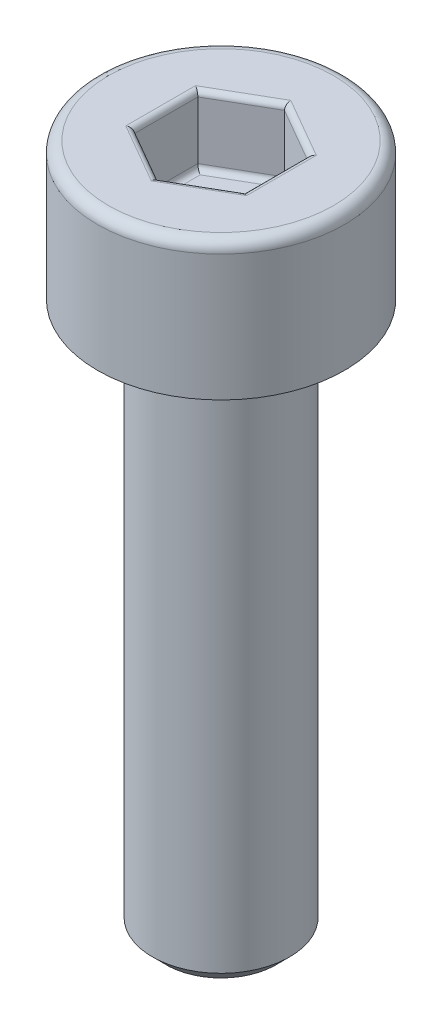
ISO-10303-21;
HEADER;
FILE_DESCRIPTION(('STEP AP214'),'2;1');
FILE_NAME('part.step','',(''),(''),'','','');
FILE_SCHEMA(('AUTOMOTIVE_DESIGN { 1 0 10303 214 1 1 1 1 }'));
ENDSEC;
DATA;
#1=APPLICATION_CONTEXT('core data for automotive mechanical design processes');
#2=APPLICATION_PROTOCOL_DEFINITION('international standard','automotive_design',2000,#1);
#3=PRODUCT_CONTEXT('',#1,'mechanical');
#4=PRODUCT('Part','Part','',(#3));
#5=PRODUCT_RELATED_PRODUCT_CATEGORY('part','',(#4));
#6=PRODUCT_DEFINITION_FORMATION('','',#4);
#7=PRODUCT_DEFINITION_CONTEXT('part definition',#1,'design');
#8=PRODUCT_DEFINITION('design','',#6,#7);
#9=PRODUCT_DEFINITION_SHAPE('','',#8);
#10=(LENGTH_UNIT() NAMED_UNIT(*) SI_UNIT(.MILLI.,.METRE.));
#11=(NAMED_UNIT(*) PLANE_ANGLE_UNIT() SI_UNIT($,.RADIAN.));
#12=(NAMED_UNIT(*) SI_UNIT($,.STERADIAN.) SOLID_ANGLE_UNIT());
#13=UNCERTAINTY_MEASURE_WITH_UNIT(LENGTH_MEASURE(1.E-05),#10,'distance_accuracy_value','');
#14=(GEOMETRIC_REPRESENTATION_CONTEXT(3) GLOBAL_UNCERTAINTY_ASSIGNED_CONTEXT((#13)) GLOBAL_UNIT_ASSIGNED_CONTEXT((#10,
#11,#12)) REPRESENTATION_CONTEXT('',''));
#15=CARTESIAN_POINT('',(0.,0.,0.));
#16=DIRECTION('',(0.,0.,1.));
#17=DIRECTION('',(1.,0.,0.));
#18=AXIS2_PLACEMENT_3D('',#15,#16,#17);
#19=CARTESIAN_POINT('',(0.,-12.5,0.));
#20=DIRECTION('',(0.,-1.,0.));
#21=DIRECTION('',(0.,0.,-1.));
#22=AXIS2_PLACEMENT_3D('',#19,#20,#21);
#23=PLANE('',#22);
#24=CARTESIAN_POINT('',(0.,-12.5,0.));
#25=DIRECTION('',(0.,-1.,0.));
#26=DIRECTION('',(0.,0.,-1.));
#27=AXIS2_PLACEMENT_3D('',#24,#25,#26);
#28=CIRCLE('',#27,0.999999999999996);
#29=CARTESIAN_POINT('',(0.,-12.5,-0.999999999999996));
#30=VERTEX_POINT('',#29);
#31=EDGE_CURVE('E261',#30,#30,#28,.T.);
#32=ORIENTED_EDGE('',*,*,#31,.T.);
#33=EDGE_LOOP('',(#32));
#34=FACE_BOUND('',#33,.T.);
#35=ADVANCED_FACE('F33',(#34),#23,.T.);
#36=CARTESIAN_POINT('',(0.,0.,0.));
#37=DIRECTION('',(0.,1.,0.));
#38=DIRECTION('',(0.,0.,1.));
#39=AXIS2_PLACEMENT_3D('',#36,#37,#38);
#40=CYLINDRICAL_SURFACE('',#39,1.25);
#41=CARTESIAN_POINT('',(0.,-2.75,0.));
#42=DIRECTION('',(0.,-1.,0.));
#43=DIRECTION('',(0.,0.,-1.));
#44=AXIS2_PLACEMENT_3D('',#41,#42,#43);
#45=CIRCLE('',#44,1.25);
#46=CARTESIAN_POINT('',(0.,-2.75,-1.25));
#47=VERTEX_POINT('',#46);
#48=EDGE_CURVE('E258',#47,#47,#45,.T.);
#49=ORIENTED_EDGE('',*,*,#48,.T.);
#50=EDGE_LOOP('',(#49));
#51=FACE_BOUND('',#50,.T.);
#52=CARTESIAN_POINT('',(0.,-12.25,0.));
#53=DIRECTION('',(0.,-1.,0.));
#54=DIRECTION('',(0.,0.,-1.));
#55=AXIS2_PLACEMENT_3D('',#52,#53,#54);
#56=CIRCLE('',#55,1.25);
#57=CARTESIAN_POINT('',(0.,-12.25,-1.25));
#58=VERTEX_POINT('',#57);
#59=EDGE_CURVE('E255',#58,#58,#56,.F.);
#60=ORIENTED_EDGE('',*,*,#59,.T.);
#61=EDGE_LOOP('',(#60));
#62=FACE_BOUND('',#61,.T.);
#63=ADVANCED_FACE('F287',(#51,#62),#40,.T.);
#64=CARTESIAN_POINT('',(-1.25,-2.5,0.));
#65=DIRECTION('',(0.,-1.,0.));
#66=DIRECTION('',(0.,0.,-1.));
#67=AXIS2_PLACEMENT_3D('',#64,#65,#66);
#68=PLANE('',#67);
#69=CARTESIAN_POINT('',(0.,-2.5,0.));
#70=DIRECTION('',(0.,-1.,0.));
#71=DIRECTION('',(0.,0.,-1.));
#72=AXIS2_PLACEMENT_3D('',#69,#70,#71);
#73=CIRCLE('',#72,1.5);
#74=CARTESIAN_POINT('',(0.,-2.5,-1.5));
#75=VERTEX_POINT('',#74);
#76=EDGE_CURVE('E252',#75,#75,#73,.F.);
#77=ORIENTED_EDGE('',*,*,#76,.T.);
#78=EDGE_LOOP('',(#77));
#79=FACE_BOUND('',#78,.T.);
#80=CARTESIAN_POINT('',(0.,-2.5,0.));
#81=DIRECTION('',(0.,1.,0.));
#82=DIRECTION('',(0.,0.,1.));
#83=AXIS2_PLACEMENT_3D('',#80,#81,#82);
#84=CIRCLE('',#83,2.25);
#85=CARTESIAN_POINT('',(0.,-2.5,2.25));
#86=VERTEX_POINT('',#85);
#87=EDGE_CURVE('E249',#86,#86,#84,.T.);
#88=ORIENTED_EDGE('',*,*,#87,.F.);
#89=EDGE_LOOP('',(#88));
#90=FACE_BOUND('',#89,.T.);
#91=ADVANCED_FACE('F293',(#79,#90),#68,.T.);
#92=CARTESIAN_POINT('',(0.,0.,0.));
#93=DIRECTION('',(0.,1.,0.));
#94=DIRECTION('',(0.,0.,1.));
#95=AXIS2_PLACEMENT_3D('',#92,#93,#94);
#96=CYLINDRICAL_SURFACE('',#95,2.25);
#97=CARTESIAN_POINT('',(0.,-0.2,0.));
#98=DIRECTION('',(0.,1.,0.));
#99=DIRECTION('',(0.,0.,1.));
#100=AXIS2_PLACEMENT_3D('',#97,#98,#99);
#101=CIRCLE('',#100,2.25);
#102=CARTESIAN_POINT('',(0.,-0.2,2.25));
#103=VERTEX_POINT('',#102);
#104=EDGE_CURVE('E159',#103,#103,#101,.F.);
#105=ORIENTED_EDGE('',*,*,#104,.T.);
#106=EDGE_LOOP('',(#105));
#107=FACE_BOUND('',#106,.T.);
#108=ORIENTED_EDGE('',*,*,#87,.T.);
#109=EDGE_LOOP('',(#108));
#110=FACE_BOUND('',#109,.T.);
#111=ADVANCED_FACE('F303',(#107,#110),#96,.T.);
#112=CARTESIAN_POINT('',(-2.25,0.,0.));
#113=DIRECTION('',(0.,1.,0.));
#114=DIRECTION('',(0.,0.,1.));
#115=AXIS2_PLACEMENT_3D('',#112,#113,#114);
#116=PLANE('',#115);
#117=DIRECTION('',(0.,0.,1.));
#118=VECTOR('',#117,1.);
#119=CARTESIAN_POINT('',(-1.1,0.,-0.577350269189627));
#120=LINE('',#119,#118);
#121=CARTESIAN_POINT('',(-1.1,0.,0.635085296108588));
#122=VERTEX_POINT('',#121);
#123=CARTESIAN_POINT('',(-1.1,0.,-0.635085296108589));
#124=VERTEX_POINT('',#123);
#125=EDGE_CURVE('E175',#122,#124,#120,.F.);
#126=ORIENTED_EDGE('',*,*,#125,.T.);
#127=DIRECTION('',(-0.866025403784439,0.,0.5));
#128=VECTOR('',#127,1.);
#129=CARTESIAN_POINT('',(-0.0500000000000009,0.,-1.2413030787577));
#130=LINE('',#129,#128);
#131=CARTESIAN_POINT('',(0.,0.,-1.27017059221718));
#132=VERTEX_POINT('',#131);
#133=EDGE_CURVE('E134',#124,#132,#130,.F.);
#134=ORIENTED_EDGE('',*,*,#133,.T.);
#135=DIRECTION('',(-0.866025403784439,0.,-0.5));
#136=VECTOR('',#135,1.);
#137=CARTESIAN_POINT('',(1.05,0.,-0.663952809568071));
#138=LINE('',#137,#136);
#139=CARTESIAN_POINT('',(1.1,0.,-0.63508529610859));
#140=VERTEX_POINT('',#139);
#141=EDGE_CURVE('E161',#132,#140,#138,.F.);
#142=ORIENTED_EDGE('',*,*,#141,.T.);
#143=DIRECTION('',(0.,0.,-1.));
#144=VECTOR('',#143,1.);
#145=CARTESIAN_POINT('',(1.1,0.,0.577350269189625));
#146=LINE('',#145,#144);
#147=CARTESIAN_POINT('',(1.1,0.,0.635085296108588));
#148=VERTEX_POINT('',#147);
#149=EDGE_CURVE('E169',#140,#148,#146,.F.);
#150=ORIENTED_EDGE('',*,*,#149,.T.);
#151=DIRECTION('',(0.866025403784439,0.,-0.5));
#152=VECTOR('',#151,1.);
#153=CARTESIAN_POINT('',(0.0499999999999991,0.,1.24130307875769));
#154=LINE('',#153,#152);
#155=CARTESIAN_POINT('',(0.,0.,1.27017059221718));
#156=VERTEX_POINT('',#155);
#157=EDGE_CURVE('E171',#148,#156,#154,.F.);
#158=ORIENTED_EDGE('',*,*,#157,.T.);
#159=DIRECTION('',(0.866025403784439,0.,0.5));
#160=VECTOR('',#159,1.);
#161=CARTESIAN_POINT('',(-1.05,0.,0.663952809568069));
#162=LINE('',#161,#160);
#163=EDGE_CURVE('E173',#156,#122,#162,.F.);
#164=ORIENTED_EDGE('',*,*,#163,.T.);
#165=EDGE_LOOP('',(#126,#134,#142,#150,#158,#164));
#166=FACE_BOUND('',#165,.T.);
#167=CARTESIAN_POINT('',(0.,0.,0.));
#168=DIRECTION('',(0.,1.,0.));
#169=DIRECTION('',(0.,0.,1.));
#170=AXIS2_PLACEMENT_3D('',#167,#168,#169);
#171=CIRCLE('',#170,2.05);
#172=CARTESIAN_POINT('',(0.,0.,2.05));
#173=VERTEX_POINT('',#172);
#174=EDGE_CURVE('E164',#173,#173,#171,.T.);
#175=ORIENTED_EDGE('',*,*,#174,.T.);
#176=EDGE_LOOP('',(#175));
#177=FACE_BOUND('',#176,.T.);
#178=ADVANCED_FACE('F266',(#166,#177),#116,.T.);
#179=CARTESIAN_POINT('',(0.,-2.5,0.));
#180=DIRECTION('',(0.,1.,0.));
#181=DIRECTION('',(0.,0.,1.));
#182=AXIS2_PLACEMENT_3D('',#179,#180,#181);
#183=CONICAL_SURFACE('',#182,1.5,0.785398163397457);
#184=ORIENTED_EDGE('',*,*,#48,.F.);
#185=EDGE_LOOP('',(#184));
#186=FACE_BOUND('',#185,.T.);
#187=ORIENTED_EDGE('',*,*,#76,.F.);
#188=EDGE_LOOP('',(#187));
#189=FACE_BOUND('',#188,.T.);
#190=ADVANCED_FACE('F281',(#186,#189),#183,.T.);
#191=CARTESIAN_POINT('',(0.,-12.25,0.));
#192=DIRECTION('',(0.,1.,0.));
#193=DIRECTION('',(0.,0.,1.));
#194=AXIS2_PLACEMENT_3D('',#191,#192,#193);
#195=CONICAL_SURFACE('',#194,1.25,0.785398163397458);
#196=ORIENTED_EDGE('',*,*,#31,.F.);
#197=EDGE_LOOP('',(#196));
#198=FACE_BOUND('',#197,.T.);
#199=ORIENTED_EDGE('',*,*,#59,.F.);
#200=EDGE_LOOP('',(#199));
#201=FACE_BOUND('',#200,.T.);
#202=ADVANCED_FACE('F271',(#198,#201),#195,.T.);
#203=CARTESIAN_POINT('',(0.,-0.2,0.));
#204=DIRECTION('',(0.,1.,0.));
#205=DIRECTION('',(0.,0.,1.));
#206=AXIS2_PLACEMENT_3D('',#203,#204,#205);
#207=TOROIDAL_SURFACE('',#206,2.05,0.2);
#208=ORIENTED_EDGE('',*,*,#104,.F.);
#209=EDGE_LOOP('',(#208));
#210=FACE_BOUND('',#209,.T.);
#211=ORIENTED_EDGE('',*,*,#174,.F.);
#212=EDGE_LOOP('',(#211));
#213=FACE_BOUND('',#212,.T.);
#214=ADVANCED_FACE('F268',(#210,#213),#207,.T.);
#215=CARTESIAN_POINT('',(0.999999999999998,-1.25,-0.577350269189627));
#216=DIRECTION('',(0.5,0.,-0.866025403784439));
#217=DIRECTION('',(-0.866025403784439,0.,-0.5));
#218=AXIS2_PLACEMENT_3D('',#215,#216,#217);
#219=PLANE('',#218);
#220=DIRECTION('',(0.,1.,0.));
#221=VECTOR('',#220,1.);
#222=CARTESIAN_POINT('',(0.999999999999998,-1.25,-0.577350269189627));
#223=LINE('',#222,#221);
#224=CARTESIAN_POINT('',(0.999999999999998,-1.15,-0.577350269189627));
#225=VERTEX_POINT('',#224);
#226=CARTESIAN_POINT('',(0.999999999999998,-0.1,-0.577350269189627));
#227=VERTEX_POINT('',#226);
#228=EDGE_CURVE('E243',#225,#227,#223,.T.);
#229=ORIENTED_EDGE('',*,*,#228,.T.);
#230=DIRECTION('',(-0.866025403784439,0.,-0.5));
#231=VECTOR('',#230,1.);
#232=CARTESIAN_POINT('',(0.,-0.1,-1.15470053837925));
#233=LINE('',#232,#231);
#234=CARTESIAN_POINT('',(0.,-0.1,-1.15470053837925));
#235=VERTEX_POINT('',#234);
#236=EDGE_CURVE('E195',#227,#235,#233,.T.);
#237=ORIENTED_EDGE('',*,*,#236,.T.);
#238=DIRECTION('',(0.,1.,0.));
#239=VECTOR('',#238,1.);
#240=CARTESIAN_POINT('',(0.,-1.25,-1.15470053837925));
#241=LINE('',#240,#239);
#242=CARTESIAN_POINT('',(0.,-1.15,-1.15470053837925));
#243=VERTEX_POINT('',#242);
#244=EDGE_CURVE('E145',#243,#235,#241,.T.);
#245=ORIENTED_EDGE('',*,*,#244,.F.);
#246=DIRECTION('',(-0.866025403784439,0.,-0.5));
#247=VECTOR('',#246,1.);
#248=CARTESIAN_POINT('',(0.999999999999998,-1.15,-0.577350269189627));
#249=LINE('',#248,#247);
#250=EDGE_CURVE('E193',#243,#225,#249,.F.);
#251=ORIENTED_EDGE('',*,*,#250,.T.);
#252=EDGE_LOOP('',(#229,#237,#245,#251));
#253=FACE_BOUND('',#252,.T.);
#254=ADVANCED_FACE('F270',(#253),#219,.F.);
#255=CARTESIAN_POINT('',(0.999999999999999,-1.25,0.577350269189625));
#256=DIRECTION('',(1.,0.,0.));
#257=DIRECTION('',(0.,0.,-1.));
#258=AXIS2_PLACEMENT_3D('',#255,#256,#257);
#259=PLANE('',#258);
#260=DIRECTION('',(0.,1.,0.));
#261=VECTOR('',#260,1.);
#262=CARTESIAN_POINT('',(0.999999999999999,-1.25,0.577350269189625));
#263=LINE('',#262,#261);
#264=CARTESIAN_POINT('',(0.999999999999999,-1.15,0.577350269189625));
#265=VERTEX_POINT('',#264);
#266=CARTESIAN_POINT('',(0.999999999999999,-0.1,0.577350269189625));
#267=VERTEX_POINT('',#266);
#268=EDGE_CURVE('E240',#265,#267,#263,.T.);
#269=ORIENTED_EDGE('',*,*,#268,.T.);
#270=DIRECTION('',(0.,0.,-1.));
#271=VECTOR('',#270,1.);
#272=CARTESIAN_POINT('',(0.999999999999998,-0.1,-0.577350269189627));
#273=LINE('',#272,#271);
#274=EDGE_CURVE('E191',#267,#227,#273,.T.);
#275=ORIENTED_EDGE('',*,*,#274,.T.);
#276=ORIENTED_EDGE('',*,*,#228,.F.);
#277=DIRECTION('',(0.,0.,-1.));
#278=VECTOR('',#277,1.);
#279=CARTESIAN_POINT('',(0.999999999999999,-1.15,0.577350269189625));
#280=LINE('',#279,#278);
#281=EDGE_CURVE('E188',#225,#265,#280,.F.);
#282=ORIENTED_EDGE('',*,*,#281,.T.);
#283=EDGE_LOOP('',(#269,#275,#276,#282));
#284=FACE_BOUND('',#283,.T.);
#285=ADVANCED_FACE('F278',(#284),#259,.F.);
#286=CARTESIAN_POINT('',(0.,-1.25,1.15470053837925));
#287=DIRECTION('',(0.5,0.,0.866025403784439));
#288=DIRECTION('',(0.866025403784439,0.,-0.5));
#289=AXIS2_PLACEMENT_3D('',#286,#287,#288);
#290=PLANE('',#289);
#291=DIRECTION('',(0.,1.,0.));
#292=VECTOR('',#291,1.);
#293=CARTESIAN_POINT('',(0.,-1.25,1.15470053837925));
#294=LINE('',#293,#292);
#295=CARTESIAN_POINT('',(0.,-1.15,1.15470053837925));
#296=VERTEX_POINT('',#295);
#297=CARTESIAN_POINT('',(0.,-0.1,1.15470053837925));
#298=VERTEX_POINT('',#297);
#299=EDGE_CURVE('E237',#296,#298,#294,.T.);
#300=ORIENTED_EDGE('',*,*,#299,.T.);
#301=DIRECTION('',(0.866025403784439,0.,-0.5));
#302=VECTOR('',#301,1.);
#303=CARTESIAN_POINT('',(0.999999999999999,-0.1,0.577350269189625));
#304=LINE('',#303,#302);
#305=EDGE_CURVE('E186',#298,#267,#304,.T.);
#306=ORIENTED_EDGE('',*,*,#305,.T.);
#307=ORIENTED_EDGE('',*,*,#268,.F.);
#308=DIRECTION('',(0.866025403784439,0.,-0.5));
#309=VECTOR('',#308,1.);
#310=CARTESIAN_POINT('',(0.,-1.15,1.15470053837925));
#311=LINE('',#310,#309);
#312=EDGE_CURVE('E184',#265,#296,#311,.F.);
#313=ORIENTED_EDGE('',*,*,#312,.T.);
#314=EDGE_LOOP('',(#300,#306,#307,#313));
#315=FACE_BOUND('',#314,.T.);
#316=ADVANCED_FACE('F327',(#315),#290,.F.);
#317=CARTESIAN_POINT('',(-1.,-1.25,0.577350269189625));
#318=DIRECTION('',(-0.5,0.,0.866025403784438));
#319=DIRECTION('',(0.866025403784439,0.,0.5));
#320=AXIS2_PLACEMENT_3D('',#317,#318,#319);
#321=PLANE('',#320);
#322=DIRECTION('',(0.,1.,0.));
#323=VECTOR('',#322,1.);
#324=CARTESIAN_POINT('',(-1.,-1.25,0.577350269189625));
#325=LINE('',#324,#323);
#326=CARTESIAN_POINT('',(-1.,-1.15,0.577350269189625));
#327=VERTEX_POINT('',#326);
#328=CARTESIAN_POINT('',(-1.,-0.1,0.577350269189625));
#329=VERTEX_POINT('',#328);
#330=EDGE_CURVE('E128',#327,#329,#325,.T.);
#331=ORIENTED_EDGE('',*,*,#330,.T.);
#332=DIRECTION('',(0.866025403784439,0.,0.5));
#333=VECTOR('',#332,1.);
#334=CARTESIAN_POINT('',(0.,-0.1,1.15470053837925));
#335=LINE('',#334,#333);
#336=EDGE_CURVE('E182',#329,#298,#335,.T.);
#337=ORIENTED_EDGE('',*,*,#336,.T.);
#338=ORIENTED_EDGE('',*,*,#299,.F.);
#339=DIRECTION('',(0.866025403784439,0.,0.5));
#340=VECTOR('',#339,1.);
#341=CARTESIAN_POINT('',(-1.,-1.15,0.577350269189625));
#342=LINE('',#341,#340);
#343=EDGE_CURVE('E180',#296,#327,#342,.F.);
#344=ORIENTED_EDGE('',*,*,#343,.T.);
#345=EDGE_LOOP('',(#331,#337,#338,#344));
#346=FACE_BOUND('',#345,.T.);
#347=ADVANCED_FACE('F234',(#346),#321,.F.);
#348=CARTESIAN_POINT('',(-1.,-1.25,-0.577350269189627));
#349=DIRECTION('',(-1.,0.,0.));
#350=DIRECTION('',(0.,0.,1.));
#351=AXIS2_PLACEMENT_3D('',#348,#349,#350);
#352=PLANE('',#351);
#353=DIRECTION('',(0.,1.,0.));
#354=VECTOR('',#353,1.);
#355=CARTESIAN_POINT('',(-1.,-1.25,-0.577350269189627));
#356=LINE('',#355,#354);
#357=CARTESIAN_POINT('',(-1.,-1.15,-0.577350269189627));
#358=VERTEX_POINT('',#357);
#359=CARTESIAN_POINT('',(-1.,-0.1,-0.577350269189627));
#360=VERTEX_POINT('',#359);
#361=EDGE_CURVE('E126',#358,#360,#356,.T.);
#362=ORIENTED_EDGE('',*,*,#361,.T.);
#363=DIRECTION('',(0.,0.,1.));
#364=VECTOR('',#363,1.);
#365=CARTESIAN_POINT('',(-1.,-0.1,0.577350269189625));
#366=LINE('',#365,#364);
#367=EDGE_CURVE('E133',#360,#329,#366,.T.);
#368=ORIENTED_EDGE('',*,*,#367,.T.);
#369=ORIENTED_EDGE('',*,*,#330,.F.);
#370=DIRECTION('',(0.,0.,1.));
#371=VECTOR('',#370,1.);
#372=CARTESIAN_POINT('',(-1.,-1.15,-0.577350269189627));
#373=LINE('',#372,#371);
#374=EDGE_CURVE('E123',#327,#358,#373,.F.);
#375=ORIENTED_EDGE('',*,*,#374,.T.);
#376=EDGE_LOOP('',(#362,#368,#369,#375));
#377=FACE_BOUND('',#376,.T.);
#378=ADVANCED_FACE('F125',(#377),#352,.F.);
#379=CARTESIAN_POINT('',(0.,-1.25,-1.15470053837925));
#380=DIRECTION('',(-0.5,0.,-0.866025403784438));
#381=DIRECTION('',(-0.866025403784439,0.,0.5));
#382=AXIS2_PLACEMENT_3D('',#379,#380,#381);
#383=PLANE('',#382);
#384=ORIENTED_EDGE('',*,*,#244,.T.);
#385=DIRECTION('',(-0.866025403784439,0.,0.5));
#386=VECTOR('',#385,1.);
#387=CARTESIAN_POINT('',(-1.,-0.1,-0.577350269189626));
#388=LINE('',#387,#386);
#389=EDGE_CURVE('E144',#235,#360,#388,.T.);
#390=ORIENTED_EDGE('',*,*,#389,.T.);
#391=ORIENTED_EDGE('',*,*,#361,.F.);
#392=DIRECTION('',(-0.866025403784439,0.,0.5));
#393=VECTOR('',#392,1.);
#394=CARTESIAN_POINT('',(0.,-1.15,-1.15470053837925));
#395=LINE('',#394,#393);
#396=EDGE_CURVE('E141',#358,#243,#395,.F.);
#397=ORIENTED_EDGE('',*,*,#396,.T.);
#398=EDGE_LOOP('',(#384,#390,#391,#397));
#399=FACE_BOUND('',#398,.T.);
#400=ADVANCED_FACE('F139',(#399),#383,.F.);
#401=CARTESIAN_POINT('',(0.,-1.25,-1.15470053837925));
#402=DIRECTION('',(0.,1.,0.));
#403=DIRECTION('',(0.,0.,1.));
#404=AXIS2_PLACEMENT_3D('',#401,#402,#403);
#405=PLANE('',#404);
#406=DIRECTION('',(0.866025403784439,0.,-0.5));
#407=VECTOR('',#406,1.);
#408=CARTESIAN_POINT('',(0.949999999999999,-1.25,0.490747728811181));
#409=LINE('',#408,#407);
#410=CARTESIAN_POINT('',(0.,-1.25,1.03923048454133));
#411=VERTEX_POINT('',#410);
#412=CARTESIAN_POINT('',(0.899999999999999,-1.25,0.519615242270663));
#413=VERTEX_POINT('',#412);
#414=EDGE_CURVE('E42',#411,#413,#409,.T.);
#415=ORIENTED_EDGE('',*,*,#414,.T.);
#416=DIRECTION('',(0.,0.,-1.));
#417=VECTOR('',#416,1.);
#418=CARTESIAN_POINT('',(0.899999999999998,-1.25,-1.15470053837925));
#419=LINE('',#418,#417);
#420=CARTESIAN_POINT('',(0.899999999999998,-1.25,-0.519615242270664));
#421=VERTEX_POINT('',#420);
#422=EDGE_CURVE('E11',#413,#421,#419,.T.);
#423=ORIENTED_EDGE('',*,*,#422,.T.);
#424=DIRECTION('',(-0.866025403784439,0.,-0.5));
#425=VECTOR('',#424,1.);
#426=CARTESIAN_POINT('',(-0.0500000000000008,-1.25,-1.06809799800081));
#427=LINE('',#426,#425);
#428=CARTESIAN_POINT('',(0.,-1.25,-1.03923048454133));
#429=VERTEX_POINT('',#428);
#430=EDGE_CURVE('E197',#421,#429,#427,.T.);
#431=ORIENTED_EDGE('',*,*,#430,.T.);
#432=DIRECTION('',(-0.866025403784439,0.,0.5));
#433=VECTOR('',#432,1.);
#434=CARTESIAN_POINT('',(0.0499999999999993,-1.25,-1.06809799800081));
#435=LINE('',#434,#433);
#436=CARTESIAN_POINT('',(-0.9,-1.25,-0.519615242270664));
#437=VERTEX_POINT('',#436);
#438=EDGE_CURVE('E199',#429,#437,#435,.T.);
#439=ORIENTED_EDGE('',*,*,#438,.T.);
#440=DIRECTION('',(0.,0.,1.));
#441=VECTOR('',#440,1.);
#442=CARTESIAN_POINT('',(-0.9,-1.25,-1.15470053837925));
#443=LINE('',#442,#441);
#444=CARTESIAN_POINT('',(-0.9,-1.25,0.519615242270662));
#445=VERTEX_POINT('',#444);
#446=EDGE_CURVE('E150',#437,#445,#443,.T.);
#447=ORIENTED_EDGE('',*,*,#446,.T.);
#448=DIRECTION('',(0.866025403784439,0.,0.5));
#449=VECTOR('',#448,1.);
#450=CARTESIAN_POINT('',(-0.950000000000001,-1.25,0.490747728811181));
#451=LINE('',#450,#449);
#452=EDGE_CURVE('E53',#445,#411,#451,.T.);
#453=ORIENTED_EDGE('',*,*,#452,.T.);
#454=EDGE_LOOP('',(#415,#423,#431,#439,#447,#453));
#455=FACE_BOUND('',#454,.T.);
#456=ADVANCED_FACE('F322',(#455),#405,.T.);
#457=CARTESIAN_POINT('',(0.0499999999999991,-0.1,1.24130307875769));
#458=DIRECTION('',(-0.866025403784439,0.,0.5));
#459=DIRECTION('',(0.5,0.,0.866025403784439));
#460=AXIS2_PLACEMENT_3D('',#457,#458,#459);
#461=CYLINDRICAL_SURFACE('',#460,0.1);
#462=CARTESIAN_POINT('',(0.,-0.1,1.27017059221718));
#463=DIRECTION('',(-1.,0.,0.));
#464=DIRECTION('',(0.,0.,-1.));
#465=AXIS2_PLACEMENT_3D('',#462,#463,#464);
#466=ELLIPSE('',#465,0.115470053837925,0.1);
#467=EDGE_CURVE('E214',#156,#298,#466,.T.);
#468=ORIENTED_EDGE('',*,*,#467,.F.);
#469=ORIENTED_EDGE('',*,*,#157,.F.);
#470=CARTESIAN_POINT('',(1.1,-0.1,0.635085296108588));
#471=DIRECTION('',(-0.5,0.,0.866025403784439));
#472=DIRECTION('',(-0.866025403784439,0.,-0.5));
#473=AXIS2_PLACEMENT_3D('',#470,#471,#472);
#474=ELLIPSE('',#473,0.115470053837925,0.1);
#475=EDGE_CURVE('E217',#267,#148,#474,.F.);
#476=ORIENTED_EDGE('',*,*,#475,.F.);
#477=ORIENTED_EDGE('',*,*,#305,.F.);
#478=EDGE_LOOP('',(#468,#469,#476,#477));
#479=FACE_BOUND('',#478,.T.);
#480=ADVANCED_FACE('F334',(#479),#461,.T.);
#481=CARTESIAN_POINT('',(1.1,-0.1,0.577350269189625));
#482=DIRECTION('',(0.,0.,1.));
#483=DIRECTION('',(1.,0.,0.));
#484=AXIS2_PLACEMENT_3D('',#481,#482,#483);
#485=CYLINDRICAL_SURFACE('',#484,0.1);
#486=ORIENTED_EDGE('',*,*,#475,.T.);
#487=ORIENTED_EDGE('',*,*,#149,.F.);
#488=CARTESIAN_POINT('',(1.1,-0.1,-0.63508529610859));
#489=DIRECTION('',(0.5,0.,0.866025403784439));
#490=DIRECTION('',(-0.866025403784439,0.,0.5));
#491=AXIS2_PLACEMENT_3D('',#488,#489,#490);
#492=ELLIPSE('',#491,0.115470053837925,0.1);
#493=EDGE_CURVE('E211',#227,#140,#492,.F.);
#494=ORIENTED_EDGE('',*,*,#493,.F.);
#495=ORIENTED_EDGE('',*,*,#274,.F.);
#496=EDGE_LOOP('',(#486,#487,#494,#495));
#497=FACE_BOUND('',#496,.T.);
#498=ADVANCED_FACE('F338',(#497),#485,.T.);
#499=CARTESIAN_POINT('',(-1.05,-0.1,0.663952809568069));
#500=DIRECTION('',(-0.866025403784439,0.,-0.5));
#501=DIRECTION('',(-0.5,0.,0.866025403784438));
#502=AXIS2_PLACEMENT_3D('',#499,#500,#501);
#503=CYLINDRICAL_SURFACE('',#502,0.1);
#504=ORIENTED_EDGE('',*,*,#467,.T.);
#505=ORIENTED_EDGE('',*,*,#336,.F.);
#506=CARTESIAN_POINT('',(-1.1,-0.1,0.635085296108587));
#507=DIRECTION('',(-0.5,0.,-0.866025403784439));
#508=DIRECTION('',(0.866025403784439,0.,-0.5));
#509=AXIS2_PLACEMENT_3D('',#506,#507,#508);
#510=ELLIPSE('',#509,0.115470053837925,0.1);
#511=EDGE_CURVE('E208',#122,#329,#510,.T.);
#512=ORIENTED_EDGE('',*,*,#511,.F.);
#513=ORIENTED_EDGE('',*,*,#163,.F.);
#514=EDGE_LOOP('',(#504,#505,#512,#513));
#515=FACE_BOUND('',#514,.T.);
#516=ADVANCED_FACE('F344',(#515),#503,.T.);
#517=CARTESIAN_POINT('',(1.05,-0.1,-0.663952809568071));
#518=DIRECTION('',(0.866025403784439,0.,0.5));
#519=DIRECTION('',(0.5,0.,-0.866025403784439));
#520=AXIS2_PLACEMENT_3D('',#517,#518,#519);
#521=CYLINDRICAL_SURFACE('',#520,0.1);
#522=ORIENTED_EDGE('',*,*,#493,.T.);
#523=ORIENTED_EDGE('',*,*,#141,.F.);
#524=CARTESIAN_POINT('',(0.,-0.1,-1.27017059221718));
#525=DIRECTION('',(1.,0.,0.));
#526=DIRECTION('',(0.,0.,-1.));
#527=AXIS2_PLACEMENT_3D('',#524,#525,#526);
#528=ELLIPSE('',#527,0.115470053837925,0.1);
#529=EDGE_CURVE('E206',#235,#132,#528,.F.);
#530=ORIENTED_EDGE('',*,*,#529,.F.);
#531=ORIENTED_EDGE('',*,*,#236,.F.);
#532=EDGE_LOOP('',(#522,#523,#530,#531));
#533=FACE_BOUND('',#532,.T.);
#534=ADVANCED_FACE('F374',(#533),#521,.T.);
#535=CARTESIAN_POINT('',(-1.1,-0.1,-0.577350269189627));
#536=DIRECTION('',(0.,0.,-1.));
#537=DIRECTION('',(-1.,0.,0.));
#538=AXIS2_PLACEMENT_3D('',#535,#536,#537);
#539=CYLINDRICAL_SURFACE('',#538,0.1);
#540=ORIENTED_EDGE('',*,*,#511,.T.);
#541=ORIENTED_EDGE('',*,*,#367,.F.);
#542=CARTESIAN_POINT('',(-1.1,-0.1,-0.635085296108589));
#543=DIRECTION('',(0.5,0.,-0.866025403784439));
#544=DIRECTION('',(0.866025403784439,0.,0.5));
#545=AXIS2_PLACEMENT_3D('',#542,#543,#544);
#546=ELLIPSE('',#545,0.115470053837925,0.1);
#547=EDGE_CURVE('E204',#124,#360,#546,.T.);
#548=ORIENTED_EDGE('',*,*,#547,.F.);
#549=ORIENTED_EDGE('',*,*,#125,.F.);
#550=EDGE_LOOP('',(#540,#541,#548,#549));
#551=FACE_BOUND('',#550,.T.);
#552=ADVANCED_FACE('F369',(#551),#539,.T.);
#553=CARTESIAN_POINT('',(-0.0500000000000009,-0.1,-1.2413030787577));
#554=DIRECTION('',(0.866025403784439,0.,-0.5));
#555=DIRECTION('',(-0.5,0.,-0.866025403784438));
#556=AXIS2_PLACEMENT_3D('',#553,#554,#555);
#557=CYLINDRICAL_SURFACE('',#556,0.1);
#558=ORIENTED_EDGE('',*,*,#529,.T.);
#559=ORIENTED_EDGE('',*,*,#133,.F.);
#560=ORIENTED_EDGE('',*,*,#547,.T.);
#561=ORIENTED_EDGE('',*,*,#389,.F.);
#562=EDGE_LOOP('',(#558,#559,#560,#561));
#563=FACE_BOUND('',#562,.T.);
#564=ADVANCED_FACE('F365',(#563),#557,.T.);
#565=CARTESIAN_POINT('',(-0.9,-1.15,-1.15470053837925));
#566=DIRECTION('',(0.,0.,1.));
#567=DIRECTION('',(1.,0.,0.));
#568=AXIS2_PLACEMENT_3D('',#565,#566,#567);
#569=CYLINDRICAL_SURFACE('',#568,0.1);
#570=CARTESIAN_POINT('',(-0.900000000000001,-1.15,-0.519615242270664));
#571=DIRECTION('',(-0.5,0.,0.866025403784439));
#572=DIRECTION('',(0.866025403784439,0.,0.5));
#573=AXIS2_PLACEMENT_3D('',#570,#571,#572);
#574=ELLIPSE('',#573,0.115470053837925,0.1);
#575=EDGE_CURVE('E149',#358,#437,#574,.T.);
#576=ORIENTED_EDGE('',*,*,#575,.F.);
#577=ORIENTED_EDGE('',*,*,#374,.F.);
#578=CARTESIAN_POINT('',(-0.9,-1.15,0.519615242270662));
#579=DIRECTION('',(0.5,0.,0.866025403784439));
#580=DIRECTION('',(0.866025403784439,0.,-0.5));
#581=AXIS2_PLACEMENT_3D('',#578,#579,#580);
#582=ELLIPSE('',#581,0.115470053837925,0.1);
#583=EDGE_CURVE('E37',#445,#327,#582,.F.);
#584=ORIENTED_EDGE('',*,*,#583,.F.);
#585=ORIENTED_EDGE('',*,*,#446,.F.);
#586=EDGE_LOOP('',(#576,#577,#584,#585));
#587=FACE_BOUND('',#586,.T.);
#588=ADVANCED_FACE('F35',(#587),#569,.F.);
#589=CARTESIAN_POINT('',(-0.950000000000001,-1.15,0.490747728811181));
#590=DIRECTION('',(0.866025403784439,0.,0.5));
#591=DIRECTION('',(0.5,0.,-0.866025403784438));
#592=AXIS2_PLACEMENT_3D('',#589,#590,#591);
#593=CYLINDRICAL_SURFACE('',#592,0.1);
#594=ORIENTED_EDGE('',*,*,#583,.T.);
#595=ORIENTED_EDGE('',*,*,#343,.F.);
#596=CARTESIAN_POINT('',(0.,-1.15,1.03923048454133));
#597=DIRECTION('',(1.,0.,0.));
#598=DIRECTION('',(0.,0.,-1.));
#599=AXIS2_PLACEMENT_3D('',#596,#597,#598);
#600=ELLIPSE('',#599,0.115470053837925,0.1);
#601=EDGE_CURVE('E153',#411,#296,#600,.F.);
#602=ORIENTED_EDGE('',*,*,#601,.F.);
#603=ORIENTED_EDGE('',*,*,#452,.F.);
#604=EDGE_LOOP('',(#594,#595,#602,#603));
#605=FACE_BOUND('',#604,.T.);
#606=ADVANCED_FACE('F231',(#605),#593,.F.);
#607=CARTESIAN_POINT('',(0.0499999999999993,-1.15,-1.06809799800081));
#608=DIRECTION('',(-0.866025403784439,0.,0.5));
#609=DIRECTION('',(0.5,0.,0.866025403784438));
#610=AXIS2_PLACEMENT_3D('',#607,#608,#609);
#611=CYLINDRICAL_SURFACE('',#610,0.1);
#612=ORIENTED_EDGE('',*,*,#575,.T.);
#613=ORIENTED_EDGE('',*,*,#438,.F.);
#614=CARTESIAN_POINT('',(0.,-1.15,-1.03923048454133));
#615=DIRECTION('',(-1.,0.,0.));
#616=DIRECTION('',(0.,0.,1.));
#617=AXIS2_PLACEMENT_3D('',#614,#615,#616);
#618=ELLIPSE('',#617,0.115470053837925,0.1);
#619=EDGE_CURVE('E157',#243,#429,#618,.T.);
#620=ORIENTED_EDGE('',*,*,#619,.F.);
#621=ORIENTED_EDGE('',*,*,#396,.F.);
#622=EDGE_LOOP('',(#612,#613,#620,#621));
#623=FACE_BOUND('',#622,.T.);
#624=ADVANCED_FACE('F155',(#623),#611,.F.);
#625=CARTESIAN_POINT('',(0.949999999999999,-1.15,0.490747728811181));
#626=DIRECTION('',(0.866025403784439,0.,-0.5));
#627=DIRECTION('',(-0.5,0.,-0.866025403784439));
#628=AXIS2_PLACEMENT_3D('',#625,#626,#627);
#629=CYLINDRICAL_SURFACE('',#628,0.1);
#630=ORIENTED_EDGE('',*,*,#601,.T.);
#631=ORIENTED_EDGE('',*,*,#312,.F.);
#632=CARTESIAN_POINT('',(0.899999999999999,-1.15,0.519615242270662));
#633=DIRECTION('',(0.5,0.,-0.866025403784439));
#634=DIRECTION('',(-0.866025403784439,0.,-0.5));
#635=AXIS2_PLACEMENT_3D('',#632,#633,#634);
#636=ELLIPSE('',#635,0.115470053837925,0.1);
#637=EDGE_CURVE('E222',#413,#265,#636,.F.);
#638=ORIENTED_EDGE('',*,*,#637,.F.);
#639=ORIENTED_EDGE('',*,*,#414,.F.);
#640=EDGE_LOOP('',(#630,#631,#638,#639));
#641=FACE_BOUND('',#640,.T.);
#642=ADVANCED_FACE('F228',(#641),#629,.F.);
#643=CARTESIAN_POINT('',(-0.0500000000000008,-1.15,-1.06809799800081));
#644=DIRECTION('',(-0.866025403784439,0.,-0.5));
#645=DIRECTION('',(-0.5,0.,0.866025403784439));
#646=AXIS2_PLACEMENT_3D('',#643,#644,#645);
#647=CYLINDRICAL_SURFACE('',#646,0.1);
#648=ORIENTED_EDGE('',*,*,#619,.T.);
#649=ORIENTED_EDGE('',*,*,#430,.F.);
#650=CARTESIAN_POINT('',(0.899999999999998,-1.15,-0.519615242270664));
#651=DIRECTION('',(-0.5,0.,-0.866025403784439));
#652=DIRECTION('',(0.866025403784439,0.,-0.5));
#653=AXIS2_PLACEMENT_3D('',#650,#651,#652);
#654=ELLIPSE('',#653,0.115470053837925,0.1);
#655=EDGE_CURVE('E220',#225,#421,#654,.T.);
#656=ORIENTED_EDGE('',*,*,#655,.F.);
#657=ORIENTED_EDGE('',*,*,#250,.F.);
#658=EDGE_LOOP('',(#648,#649,#656,#657));
#659=FACE_BOUND('',#658,.T.);
#660=ADVANCED_FACE('F353',(#659),#647,.F.);
#661=CARTESIAN_POINT('',(0.899999999999998,-1.15,-1.15470053837925));
#662=DIRECTION('',(0.,0.,-1.));
#663=DIRECTION('',(-1.,0.,0.));
#664=AXIS2_PLACEMENT_3D('',#661,#662,#663);
#665=CYLINDRICAL_SURFACE('',#664,0.1);
#666=ORIENTED_EDGE('',*,*,#637,.T.);
#667=ORIENTED_EDGE('',*,*,#281,.F.);
#668=ORIENTED_EDGE('',*,*,#655,.T.);
#669=ORIENTED_EDGE('',*,*,#422,.F.);
#670=EDGE_LOOP('',(#666,#667,#668,#669));
#671=FACE_BOUND('',#670,.T.);
#672=ADVANCED_FACE('F350',(#671),#665,.F.);
#673=CLOSED_SHELL('',(#35,#63,#91,#111,#178,#190,#202,#214,#254,#285,#316,#347,#378,#400,#456,
#480,#498,#516,#534,#552,#564,#588,#606,#624,#642,#660,#672));
#674=MANIFOLD_SOLID_BREP('B2',#673);
#675=ADVANCED_BREP_SHAPE_REPRESENTATION('',(#18,#674),#14);
#676=SHAPE_DEFINITION_REPRESENTATION(#9,#675);
ENDSEC;
END-ISO-10303-21;
